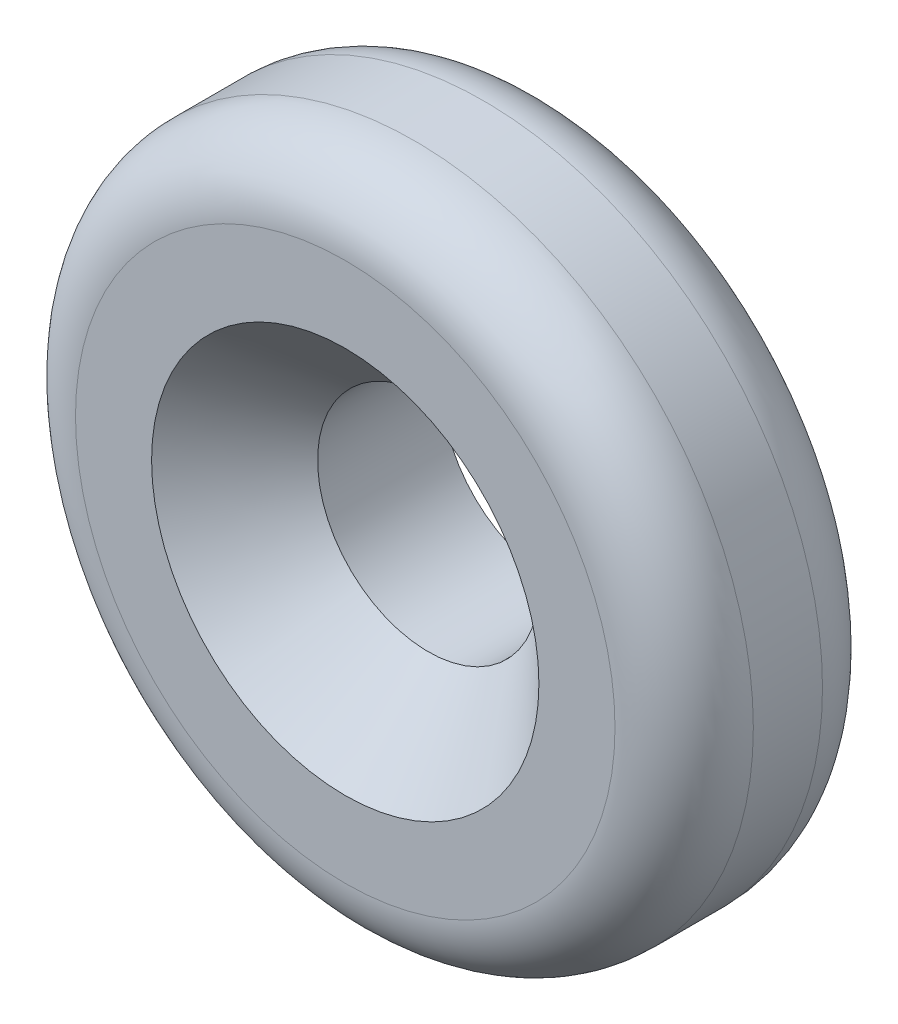
ISO-10303-21;
HEADER;
FILE_DESCRIPTION(('STEP AP214'),'2;1');
FILE_NAME('part.step','',(''),(''),'','','');
FILE_SCHEMA(('AUTOMOTIVE_DESIGN { 1 0 10303 214 1 1 1 1 }'));
ENDSEC;
DATA;
#1=APPLICATION_CONTEXT('core data for automotive mechanical design processes');
#2=APPLICATION_PROTOCOL_DEFINITION('international standard','automotive_design',2000,#1);
#3=PRODUCT_CONTEXT('',#1,'mechanical');
#4=PRODUCT('Part','Part','',(#3));
#5=PRODUCT_RELATED_PRODUCT_CATEGORY('part','',(#4));
#6=PRODUCT_DEFINITION_FORMATION('','',#4);
#7=PRODUCT_DEFINITION_CONTEXT('part definition',#1,'design');
#8=PRODUCT_DEFINITION('design','',#6,#7);
#9=PRODUCT_DEFINITION_SHAPE('','',#8);
#10=(LENGTH_UNIT() NAMED_UNIT(*) SI_UNIT(.MILLI.,.METRE.));
#11=(NAMED_UNIT(*) PLANE_ANGLE_UNIT() SI_UNIT($,.RADIAN.));
#12=(NAMED_UNIT(*) SI_UNIT($,.STERADIAN.) SOLID_ANGLE_UNIT());
#13=UNCERTAINTY_MEASURE_WITH_UNIT(LENGTH_MEASURE(1.E-05),#10,'distance_accuracy_value','');
#14=(GEOMETRIC_REPRESENTATION_CONTEXT(3) GLOBAL_UNCERTAINTY_ASSIGNED_CONTEXT((#13)) GLOBAL_UNIT_ASSIGNED_CONTEXT((#10,
#11,#12)) REPRESENTATION_CONTEXT('',''));
#15=CARTESIAN_POINT('',(0.,0.,0.));
#16=DIRECTION('',(0.,0.,1.));
#17=DIRECTION('',(1.,0.,0.));
#18=AXIS2_PLACEMENT_3D('',#15,#16,#17);
#19=CARTESIAN_POINT('',(0.,0.,3.));
#20=DIRECTION('',(0.,0.,-1.));
#21=DIRECTION('',(-1.,0.,0.));
#22=AXIS2_PLACEMENT_3D('',#19,#20,#21);
#23=CYLINDRICAL_SURFACE('',#22,4.9);
#24=CARTESIAN_POINT('',(0.,0.,1.));
#25=DIRECTION('',(0.,0.,1.));
#26=DIRECTION('',(1.,0.,0.));
#27=AXIS2_PLACEMENT_3D('',#24,#25,#26);
#28=CIRCLE('',#27,4.9);
#29=CARTESIAN_POINT('',(4.9,0.,1.));
#30=VERTEX_POINT('',#29);
#31=EDGE_CURVE('E48',#30,#30,#28,.T.);
#32=ORIENTED_EDGE('',*,*,#31,.T.);
#33=EDGE_LOOP('',(#32));
#34=FACE_BOUND('',#33,.T.);
#35=CARTESIAN_POINT('',(0.,0.,2.));
#36=DIRECTION('',(0.,0.,1.));
#37=DIRECTION('',(1.,0.,0.));
#38=AXIS2_PLACEMENT_3D('',#35,#36,#37);
#39=CIRCLE('',#38,4.9);
#40=CARTESIAN_POINT('',(4.9,0.,2.));
#41=VERTEX_POINT('',#40);
#42=EDGE_CURVE('E55',#41,#41,#39,.F.);
#43=ORIENTED_EDGE('',*,*,#42,.T.);
#44=EDGE_LOOP('',(#43));
#45=FACE_BOUND('',#44,.T.);
#46=ADVANCED_FACE('F41',(#34,#45),#23,.T.);
#47=CARTESIAN_POINT('',(0.,0.,3.));
#48=DIRECTION('',(0.,0.,1.));
#49=DIRECTION('',(1.,0.,0.));
#50=AXIS2_PLACEMENT_3D('',#47,#48,#49);
#51=PLANE('',#50);
#52=CARTESIAN_POINT('',(0.,0.,3.));
#53=DIRECTION('',(0.,0.,1.));
#54=DIRECTION('',(1.,0.,0.));
#55=AXIS2_PLACEMENT_3D('',#52,#53,#54);
#56=CIRCLE('',#55,3.9);
#57=CARTESIAN_POINT('',(3.9,0.,3.));
#58=VERTEX_POINT('',#57);
#59=EDGE_CURVE('E57',#58,#58,#56,.T.);
#60=ORIENTED_EDGE('',*,*,#59,.T.);
#61=EDGE_LOOP('',(#60));
#62=FACE_BOUND('',#61,.T.);
#63=CARTESIAN_POINT('',(0.,0.,3.));
#64=DIRECTION('',(0.,0.,1.));
#65=DIRECTION('',(1.,0.,0.));
#66=AXIS2_PLACEMENT_3D('',#63,#64,#65);
#67=CIRCLE('',#66,2.8);
#68=CARTESIAN_POINT('',(2.8,0.,3.));
#69=VERTEX_POINT('',#68);
#70=EDGE_CURVE('E62',#69,#69,#67,.F.);
#71=ORIENTED_EDGE('',*,*,#70,.T.);
#72=EDGE_LOOP('',(#71));
#73=FACE_BOUND('',#72,.T.);
#74=ADVANCED_FACE('F83',(#62,#73),#51,.T.);
#75=CARTESIAN_POINT('',(0.,0.,0.));
#76=DIRECTION('',(0.,0.,1.));
#77=DIRECTION('',(1.,0.,0.));
#78=AXIS2_PLACEMENT_3D('',#75,#76,#77);
#79=PLANE('',#78);
#80=CARTESIAN_POINT('',(0.,0.,0.));
#81=DIRECTION('',(0.,0.,1.));
#82=DIRECTION('',(1.,0.,0.));
#83=AXIS2_PLACEMENT_3D('',#80,#81,#82);
#84=CIRCLE('',#83,3.9);
#85=CARTESIAN_POINT('',(3.9,0.,0.));
#86=VERTEX_POINT('',#85);
#87=EDGE_CURVE('E10',#86,#86,#84,.F.);
#88=ORIENTED_EDGE('',*,*,#87,.T.);
#89=EDGE_LOOP('',(#88));
#90=FACE_BOUND('',#89,.T.);
#91=CARTESIAN_POINT('',(0.,0.,0.));
#92=DIRECTION('',(0.,0.,1.));
#93=DIRECTION('',(1.,0.,0.));
#94=AXIS2_PLACEMENT_3D('',#91,#92,#93);
#95=CIRCLE('',#94,1.6);
#96=CARTESIAN_POINT('',(1.6,0.,0.));
#97=VERTEX_POINT('',#96);
#98=EDGE_CURVE('E70',#97,#97,#95,.T.);
#99=ORIENTED_EDGE('',*,*,#98,.T.);
#100=EDGE_LOOP('',(#99));
#101=FACE_BOUND('',#100,.T.);
#102=ADVANCED_FACE('F71',(#90,#101),#79,.F.);
#103=CARTESIAN_POINT('',(0.,0.,0.));
#104=DIRECTION('',(0.,0.,1.));
#105=DIRECTION('',(1.,0.,0.));
#106=AXIS2_PLACEMENT_3D('',#103,#104,#105);
#107=CYLINDRICAL_SURFACE('',#106,1.6);
#108=CARTESIAN_POINT('',(0.,0.,1.8));
#109=DIRECTION('',(0.,0.,1.));
#110=DIRECTION('',(1.,0.,0.));
#111=AXIS2_PLACEMENT_3D('',#108,#109,#110);
#112=CIRCLE('',#111,1.6);
#113=CARTESIAN_POINT('',(1.6,0.,1.8));
#114=VERTEX_POINT('',#113);
#115=EDGE_CURVE('E61',#114,#114,#112,.T.);
#116=ORIENTED_EDGE('',*,*,#115,.T.);
#117=EDGE_LOOP('',(#116));
#118=FACE_BOUND('',#117,.T.);
#119=ORIENTED_EDGE('',*,*,#98,.F.);
#120=EDGE_LOOP('',(#119));
#121=FACE_BOUND('',#120,.T.);
#122=ADVANCED_FACE('F73',(#118,#121),#107,.F.);
#123=CARTESIAN_POINT('',(0.,0.,1.8));
#124=DIRECTION('',(0.,0.,1.));
#125=DIRECTION('',(1.,0.,0.));
#126=AXIS2_PLACEMENT_3D('',#123,#124,#125);
#127=CONICAL_SURFACE('',#126,1.6,0.785398163397449);
#128=ORIENTED_EDGE('',*,*,#70,.F.);
#129=EDGE_LOOP('',(#128));
#130=FACE_BOUND('',#129,.T.);
#131=ORIENTED_EDGE('',*,*,#115,.F.);
#132=EDGE_LOOP('',(#131));
#133=FACE_BOUND('',#132,.T.);
#134=ADVANCED_FACE('F74',(#130,#133),#127,.F.);
#135=CARTESIAN_POINT('',(0.,0.,2.));
#136=DIRECTION('',(0.,0.,1.));
#137=DIRECTION('',(1.,0.,0.));
#138=AXIS2_PLACEMENT_3D('',#135,#136,#137);
#139=TOROIDAL_SURFACE('',#138,3.9,1.);
#140=ORIENTED_EDGE('',*,*,#42,.F.);
#141=EDGE_LOOP('',(#140));
#142=FACE_BOUND('',#141,.T.);
#143=ORIENTED_EDGE('',*,*,#59,.F.);
#144=EDGE_LOOP('',(#143));
#145=FACE_BOUND('',#144,.T.);
#146=ADVANCED_FACE('F82',(#142,#145),#139,.T.);
#147=CARTESIAN_POINT('',(0.,0.,1.));
#148=DIRECTION('',(0.,0.,1.));
#149=DIRECTION('',(1.,0.,0.));
#150=AXIS2_PLACEMENT_3D('',#147,#148,#149);
#151=TOROIDAL_SURFACE('',#150,3.9,1.);
#152=ORIENTED_EDGE('',*,*,#87,.F.);
#153=EDGE_LOOP('',(#152));
#154=FACE_BOUND('',#153,.T.);
#155=ORIENTED_EDGE('',*,*,#31,.F.);
#156=EDGE_LOOP('',(#155));
#157=FACE_BOUND('',#156,.T.);
#158=ADVANCED_FACE('F43',(#154,#157),#151,.T.);
#159=CLOSED_SHELL('',(#46,#74,#102,#122,#134,#146,#158));
#160=MANIFOLD_SOLID_BREP('B2',#159);
#161=ADVANCED_BREP_SHAPE_REPRESENTATION('',(#18,#160),#14);
#162=SHAPE_DEFINITION_REPRESENTATION(#9,#161);
ENDSEC;
END-ISO-10303-21;
